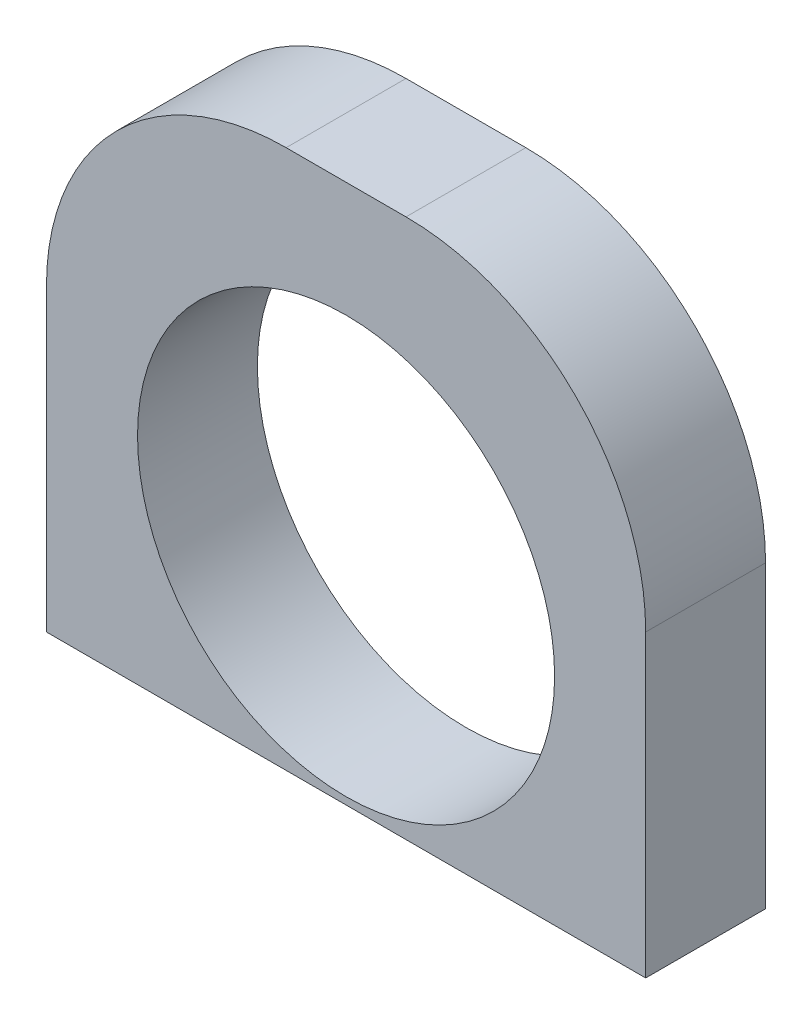
ISO-10303-21;
HEADER;
FILE_DESCRIPTION(('STEP AP214'),'2;1');
FILE_NAME('part.step','',(''),(''),'','','');
FILE_SCHEMA(('AUTOMOTIVE_DESIGN { 1 0 10303 214 1 1 1 1 }'));
ENDSEC;
DATA;
#1=APPLICATION_CONTEXT('core data for automotive mechanical design processes');
#2=APPLICATION_PROTOCOL_DEFINITION('international standard','automotive_design',2000,#1);
#3=PRODUCT_CONTEXT('',#1,'mechanical');
#4=PRODUCT('Part','Part','',(#3));
#5=PRODUCT_RELATED_PRODUCT_CATEGORY('part','',(#4));
#6=PRODUCT_DEFINITION_FORMATION('','',#4);
#7=PRODUCT_DEFINITION_CONTEXT('part definition',#1,'design');
#8=PRODUCT_DEFINITION('design','',#6,#7);
#9=PRODUCT_DEFINITION_SHAPE('','',#8);
#10=(LENGTH_UNIT() NAMED_UNIT(*) SI_UNIT(.MILLI.,.METRE.));
#11=(NAMED_UNIT(*) PLANE_ANGLE_UNIT() SI_UNIT($,.RADIAN.));
#12=(NAMED_UNIT(*) SI_UNIT($,.STERADIAN.) SOLID_ANGLE_UNIT());
#13=UNCERTAINTY_MEASURE_WITH_UNIT(LENGTH_MEASURE(1.E-05),#10,'distance_accuracy_value','');
#14=(GEOMETRIC_REPRESENTATION_CONTEXT(3) GLOBAL_UNCERTAINTY_ASSIGNED_CONTEXT((#13)) GLOBAL_UNIT_ASSIGNED_CONTEXT((#10,
#11,#12)) REPRESENTATION_CONTEXT('',''));
#15=CARTESIAN_POINT('',(0.,0.,0.));
#16=DIRECTION('',(0.,0.,1.));
#17=DIRECTION('',(1.,0.,0.));
#18=AXIS2_PLACEMENT_3D('',#15,#16,#17);
#19=CARTESIAN_POINT('',(-3.175,1.5875,6.35));
#20=DIRECTION('',(0.,0.,-1.));
#21=DIRECTION('',(-1.,0.,0.));
#22=AXIS2_PLACEMENT_3D('',#19,#20,#21);
#23=PLANE('',#22);
#24=DIRECTION('',(0.,-1.,0.));
#25=VECTOR('',#24,1.);
#26=CARTESIAN_POINT('',(-15.875,-14.2875,6.35));
#27=LINE('',#26,#25);
#28=CARTESIAN_POINT('',(-15.875,1.5875,6.35));
#29=VERTEX_POINT('',#28);
#30=CARTESIAN_POINT('',(-15.875,-14.2875,6.35));
#31=VERTEX_POINT('',#30);
#32=EDGE_CURVE('E129',#29,#31,#27,.T.);
#33=ORIENTED_EDGE('',*,*,#32,.T.);
#34=DIRECTION('',(1.,0.,0.));
#35=VECTOR('',#34,1.);
#36=CARTESIAN_POINT('',(-15.875,-14.2875,6.35));
#37=LINE('',#36,#35);
#38=CARTESIAN_POINT('',(15.875,-14.2875,6.35));
#39=VERTEX_POINT('',#38);
#40=EDGE_CURVE('E87',#31,#39,#37,.T.);
#41=ORIENTED_EDGE('',*,*,#40,.T.);
#42=DIRECTION('',(0.,1.,0.));
#43=VECTOR('',#42,1.);
#44=CARTESIAN_POINT('',(15.875,-14.2875,6.35));
#45=LINE('',#44,#43);
#46=CARTESIAN_POINT('',(15.875,1.5875,6.35));
#47=VERTEX_POINT('',#46);
#48=EDGE_CURVE('E100',#39,#47,#45,.T.);
#49=ORIENTED_EDGE('',*,*,#48,.T.);
#50=CARTESIAN_POINT('',(3.175,1.5875,6.35));
#51=DIRECTION('',(0.,0.,1.));
#52=DIRECTION('',(-1.,0.,0.));
#53=AXIS2_PLACEMENT_3D('',#50,#51,#52);
#54=CIRCLE('',#53,12.7);
#55=CARTESIAN_POINT('',(3.175,14.2875,6.35));
#56=VERTEX_POINT('',#55);
#57=EDGE_CURVE('E94',#47,#56,#54,.T.);
#58=ORIENTED_EDGE('',*,*,#57,.T.);
#59=DIRECTION('',(-1.,0.,0.));
#60=VECTOR('',#59,1.);
#61=CARTESIAN_POINT('',(-3.175,14.2875,6.35));
#62=LINE('',#61,#60);
#63=CARTESIAN_POINT('',(-3.175,14.2875,6.35));
#64=VERTEX_POINT('',#63);
#65=EDGE_CURVE('E98',#56,#64,#62,.T.);
#66=ORIENTED_EDGE('',*,*,#65,.T.);
#67=CARTESIAN_POINT('',(-3.175,1.5875,6.35));
#68=DIRECTION('',(0.,0.,1.));
#69=DIRECTION('',(-1.,0.,0.));
#70=AXIS2_PLACEMENT_3D('',#67,#68,#69);
#71=CIRCLE('',#70,12.7);
#72=EDGE_CURVE('E50',#64,#29,#71,.T.);
#73=ORIENTED_EDGE('',*,*,#72,.T.);
#74=EDGE_LOOP('',(#33,#41,#49,#58,#66,#73));
#75=FACE_BOUND('',#74,.T.);
#76=CARTESIAN_POINT('',(0.,-2.8575,6.35));
#77=DIRECTION('',(0.,0.,1.));
#78=DIRECTION('',(1.,0.,0.));
#79=AXIS2_PLACEMENT_3D('',#76,#77,#78);
#80=CIRCLE('',#79,11.049);
#81=CARTESIAN_POINT('',(11.049,-2.8575,6.35));
#82=VERTEX_POINT('',#81);
#83=EDGE_CURVE('E122',#82,#82,#80,.T.);
#84=ORIENTED_EDGE('',*,*,#83,.F.);
#85=EDGE_LOOP('',(#84));
#86=FACE_BOUND('',#85,.T.);
#87=ADVANCED_FACE('F33',(#75,#86),#23,.F.);
#88=CARTESIAN_POINT('',(-3.175,1.5875,0.));
#89=DIRECTION('',(0.,0.,-1.));
#90=DIRECTION('',(-1.,0.,0.));
#91=AXIS2_PLACEMENT_3D('',#88,#89,#90);
#92=PLANE('',#91);
#93=DIRECTION('',(0.,-1.,0.));
#94=VECTOR('',#93,1.);
#95=CARTESIAN_POINT('',(-15.875,-14.2875,0.));
#96=LINE('',#95,#94);
#97=CARTESIAN_POINT('',(-15.875,1.5875,0.));
#98=VERTEX_POINT('',#97);
#99=CARTESIAN_POINT('',(-15.875,-14.2875,0.));
#100=VERTEX_POINT('',#99);
#101=EDGE_CURVE('E118',#98,#100,#96,.T.);
#102=ORIENTED_EDGE('',*,*,#101,.F.);
#103=CARTESIAN_POINT('',(-3.175,1.5875,0.));
#104=DIRECTION('',(0.,0.,1.));
#105=DIRECTION('',(-1.,0.,0.));
#106=AXIS2_PLACEMENT_3D('',#103,#104,#105);
#107=CIRCLE('',#106,12.7);
#108=CARTESIAN_POINT('',(-3.175,14.2875,0.));
#109=VERTEX_POINT('',#108);
#110=EDGE_CURVE('E79',#109,#98,#107,.T.);
#111=ORIENTED_EDGE('',*,*,#110,.F.);
#112=DIRECTION('',(-1.,0.,0.));
#113=VECTOR('',#112,1.);
#114=CARTESIAN_POINT('',(-3.175,14.2875,0.));
#115=LINE('',#114,#113);
#116=CARTESIAN_POINT('',(3.175,14.2875,0.));
#117=VERTEX_POINT('',#116);
#118=EDGE_CURVE('E73',#117,#109,#115,.T.);
#119=ORIENTED_EDGE('',*,*,#118,.F.);
#120=CARTESIAN_POINT('',(3.175,1.5875,0.));
#121=DIRECTION('',(0.,0.,1.));
#122=DIRECTION('',(-1.,0.,0.));
#123=AXIS2_PLACEMENT_3D('',#120,#121,#122);
#124=CIRCLE('',#123,12.7);
#125=CARTESIAN_POINT('',(15.875,1.5875,0.));
#126=VERTEX_POINT('',#125);
#127=EDGE_CURVE('E108',#126,#117,#124,.T.);
#128=ORIENTED_EDGE('',*,*,#127,.F.);
#129=DIRECTION('',(0.,1.,0.));
#130=VECTOR('',#129,1.);
#131=CARTESIAN_POINT('',(15.875,-14.2875,0.));
#132=LINE('',#131,#130);
#133=CARTESIAN_POINT('',(15.875,-14.2875,0.));
#134=VERTEX_POINT('',#133);
#135=EDGE_CURVE('E124',#134,#126,#132,.T.);
#136=ORIENTED_EDGE('',*,*,#135,.F.);
#137=DIRECTION('',(1.,0.,0.));
#138=VECTOR('',#137,1.);
#139=CARTESIAN_POINT('',(-15.875,-14.2875,0.));
#140=LINE('',#139,#138);
#141=EDGE_CURVE('E121',#100,#134,#140,.T.);
#142=ORIENTED_EDGE('',*,*,#141,.F.);
#143=EDGE_LOOP('',(#102,#111,#119,#128,#136,#142));
#144=FACE_BOUND('',#143,.T.);
#145=CARTESIAN_POINT('',(0.,-2.8575,0.));
#146=DIRECTION('',(0.,0.,1.));
#147=DIRECTION('',(1.,0.,0.));
#148=AXIS2_PLACEMENT_3D('',#145,#146,#147);
#149=CIRCLE('',#148,11.049);
#150=CARTESIAN_POINT('',(11.049,-2.8575,0.));
#151=VERTEX_POINT('',#150);
#152=EDGE_CURVE('E222',#151,#151,#149,.T.);
#153=ORIENTED_EDGE('',*,*,#152,.T.);
#154=EDGE_LOOP('',(#153));
#155=FACE_BOUND('',#154,.T.);
#156=ADVANCED_FACE('F138',(#144,#155),#92,.T.);
#157=CARTESIAN_POINT('',(-15.875,-14.2875,6.35));
#158=DIRECTION('',(1.,0.,0.));
#159=DIRECTION('',(0.,1.,0.));
#160=AXIS2_PLACEMENT_3D('',#157,#158,#159);
#161=PLANE('',#160);
#162=ORIENTED_EDGE('',*,*,#101,.T.);
#163=DIRECTION('',(0.,0.,-1.));
#164=VECTOR('',#163,1.);
#165=CARTESIAN_POINT('',(-15.875,-14.2875,6.35));
#166=LINE('',#165,#164);
#167=EDGE_CURVE('E11',#31,#100,#166,.T.);
#168=ORIENTED_EDGE('',*,*,#167,.F.);
#169=ORIENTED_EDGE('',*,*,#32,.F.);
#170=DIRECTION('',(0.,0.,-1.));
#171=VECTOR('',#170,1.);
#172=CARTESIAN_POINT('',(-15.875,1.5875,6.35));
#173=LINE('',#172,#171);
#174=EDGE_CURVE('E114',#29,#98,#173,.T.);
#175=ORIENTED_EDGE('',*,*,#174,.T.);
#176=EDGE_LOOP('',(#162,#168,#169,#175));
#177=FACE_BOUND('',#176,.T.);
#178=ADVANCED_FACE('F35',(#177),#161,.F.);
#179=CARTESIAN_POINT('',(-15.875,-14.2875,6.35));
#180=DIRECTION('',(0.,1.,0.));
#181=DIRECTION('',(0.,0.,1.));
#182=AXIS2_PLACEMENT_3D('',#179,#180,#181);
#183=PLANE('',#182);
#184=ORIENTED_EDGE('',*,*,#141,.T.);
#185=DIRECTION('',(0.,0.,-1.));
#186=VECTOR('',#185,1.);
#187=CARTESIAN_POINT('',(15.875,-14.2875,6.35));
#188=LINE('',#187,#186);
#189=EDGE_CURVE('E42',#39,#134,#188,.T.);
#190=ORIENTED_EDGE('',*,*,#189,.F.);
#191=ORIENTED_EDGE('',*,*,#40,.F.);
#192=ORIENTED_EDGE('',*,*,#167,.T.);
#193=EDGE_LOOP('',(#184,#190,#191,#192));
#194=FACE_BOUND('',#193,.T.);
#195=ADVANCED_FACE('F163',(#194),#183,.F.);
#196=CARTESIAN_POINT('',(15.875,-14.2875,6.35));
#197=DIRECTION('',(-1.,0.,0.));
#198=DIRECTION('',(0.,-1.,0.));
#199=AXIS2_PLACEMENT_3D('',#196,#197,#198);
#200=PLANE('',#199);
#201=ORIENTED_EDGE('',*,*,#135,.T.);
#202=DIRECTION('',(0.,0.,-1.));
#203=VECTOR('',#202,1.);
#204=CARTESIAN_POINT('',(15.875,1.5875,6.35));
#205=LINE('',#204,#203);
#206=EDGE_CURVE('E109',#47,#126,#205,.T.);
#207=ORIENTED_EDGE('',*,*,#206,.F.);
#208=ORIENTED_EDGE('',*,*,#48,.F.);
#209=ORIENTED_EDGE('',*,*,#189,.T.);
#210=EDGE_LOOP('',(#201,#207,#208,#209));
#211=FACE_BOUND('',#210,.T.);
#212=ADVANCED_FACE('F135',(#211),#200,.F.);
#213=CARTESIAN_POINT('',(3.175,1.5875,6.35));
#214=DIRECTION('',(0.,0.,-1.));
#215=DIRECTION('',(-1.,0.,0.));
#216=AXIS2_PLACEMENT_3D('',#213,#214,#215);
#217=CYLINDRICAL_SURFACE('',#216,12.7);
#218=ORIENTED_EDGE('',*,*,#127,.T.);
#219=DIRECTION('',(0.,0.,-1.));
#220=VECTOR('',#219,1.);
#221=CARTESIAN_POINT('',(3.175,14.2875,6.35));
#222=LINE('',#221,#220);
#223=EDGE_CURVE('E105',#56,#117,#222,.T.);
#224=ORIENTED_EDGE('',*,*,#223,.F.);
#225=ORIENTED_EDGE('',*,*,#57,.F.);
#226=ORIENTED_EDGE('',*,*,#206,.T.);
#227=EDGE_LOOP('',(#218,#224,#225,#226));
#228=FACE_BOUND('',#227,.T.);
#229=ADVANCED_FACE('F106',(#228),#217,.T.);
#230=CARTESIAN_POINT('',(-3.175,14.2875,6.35));
#231=DIRECTION('',(0.,-1.,0.));
#232=DIRECTION('',(0.,0.,-1.));
#233=AXIS2_PLACEMENT_3D('',#230,#231,#232);
#234=PLANE('',#233);
#235=ORIENTED_EDGE('',*,*,#118,.T.);
#236=DIRECTION('',(0.,0.,-1.));
#237=VECTOR('',#236,1.);
#238=CARTESIAN_POINT('',(-3.175,14.2875,6.35));
#239=LINE('',#238,#237);
#240=EDGE_CURVE('E110',#64,#109,#239,.T.);
#241=ORIENTED_EDGE('',*,*,#240,.F.);
#242=ORIENTED_EDGE('',*,*,#65,.F.);
#243=ORIENTED_EDGE('',*,*,#223,.T.);
#244=EDGE_LOOP('',(#235,#241,#242,#243));
#245=FACE_BOUND('',#244,.T.);
#246=ADVANCED_FACE('F112',(#245),#234,.F.);
#247=CARTESIAN_POINT('',(-3.175,1.5875,6.35));
#248=DIRECTION('',(0.,0.,-1.));
#249=DIRECTION('',(-1.,0.,0.));
#250=AXIS2_PLACEMENT_3D('',#247,#248,#249);
#251=CYLINDRICAL_SURFACE('',#250,12.7);
#252=ORIENTED_EDGE('',*,*,#110,.T.);
#253=ORIENTED_EDGE('',*,*,#174,.F.);
#254=ORIENTED_EDGE('',*,*,#72,.F.);
#255=ORIENTED_EDGE('',*,*,#240,.T.);
#256=EDGE_LOOP('',(#252,#253,#254,#255));
#257=FACE_BOUND('',#256,.T.);
#258=ADVANCED_FACE('F143',(#257),#251,.T.);
#259=CARTESIAN_POINT('',(0.,-2.8575,6.35));
#260=DIRECTION('',(0.,0.,-1.));
#261=DIRECTION('',(-1.,0.,0.));
#262=AXIS2_PLACEMENT_3D('',#259,#260,#261);
#263=CYLINDRICAL_SURFACE('',#262,11.049);
#264=ORIENTED_EDGE('',*,*,#83,.T.);
#265=EDGE_LOOP('',(#264));
#266=FACE_BOUND('',#265,.T.);
#267=ORIENTED_EDGE('',*,*,#152,.F.);
#268=EDGE_LOOP('',(#267));
#269=FACE_BOUND('',#268,.T.);
#270=ADVANCED_FACE('F145',(#266,#269),#263,.F.);
#271=CLOSED_SHELL('',(#87,#156,#178,#195,#212,#229,#246,#258,#270));
#272=MANIFOLD_SOLID_BREP('B2',#271);
#273=ADVANCED_BREP_SHAPE_REPRESENTATION('',(#18,#272),#14);
#274=SHAPE_DEFINITION_REPRESENTATION(#9,#273);
ENDSEC;
END-ISO-10303-21;
